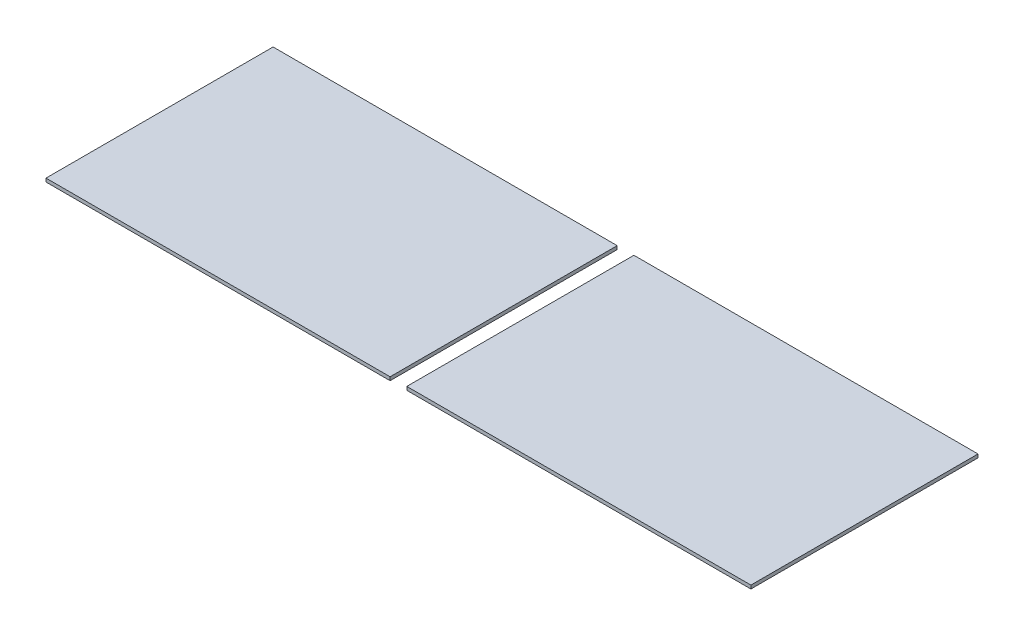
ISO-10303-21;
HEADER;
FILE_DESCRIPTION(('STEP AP214'),'2;1');
FILE_NAME('part.step','',(''),(''),'','','');
FILE_SCHEMA(('AUTOMOTIVE_DESIGN { 1 0 10303 214 1 1 1 1 }'));
ENDSEC;
DATA;
#1=APPLICATION_CONTEXT('core data for automotive mechanical design processes');
#2=APPLICATION_PROTOCOL_DEFINITION('international standard','automotive_design',2000,#1);
#3=PRODUCT_CONTEXT('',#1,'mechanical');
#4=PRODUCT('Part','Part','',(#3));
#5=PRODUCT_RELATED_PRODUCT_CATEGORY('part','',(#4));
#6=PRODUCT_DEFINITION_FORMATION('','',#4);
#7=PRODUCT_DEFINITION_CONTEXT('part definition',#1,'design');
#8=PRODUCT_DEFINITION('design','',#6,#7);
#9=PRODUCT_DEFINITION_SHAPE('','',#8);
#10=(LENGTH_UNIT() NAMED_UNIT(*) SI_UNIT(.MILLI.,.METRE.));
#11=(NAMED_UNIT(*) PLANE_ANGLE_UNIT() SI_UNIT($,.RADIAN.));
#12=(NAMED_UNIT(*) SI_UNIT($,.STERADIAN.) SOLID_ANGLE_UNIT());
#13=UNCERTAINTY_MEASURE_WITH_UNIT(LENGTH_MEASURE(1.E-05),#10,'distance_accuracy_value','');
#14=(GEOMETRIC_REPRESENTATION_CONTEXT(3) GLOBAL_UNCERTAINTY_ASSIGNED_CONTEXT((#13)) GLOBAL_UNIT_ASSIGNED_CONTEXT((#10,
#11,#12)) REPRESENTATION_CONTEXT('',''));
#15=CARTESIAN_POINT('',(0.,0.,0.));
#16=DIRECTION('',(0.,0.,1.));
#17=DIRECTION('',(1.,0.,0.));
#18=AXIS2_PLACEMENT_3D('',#15,#16,#17);
#19=CARTESIAN_POINT('',(-12.1368992991661,5.,-165.));
#20=DIRECTION('',(-1.,0.,0.));
#21=DIRECTION('',(0.,0.,-1.));
#22=AXIS2_PLACEMENT_3D('',#19,#20,#21);
#23=PLANE('',#22);
#24=DIRECTION('',(0.,0.,1.));
#25=VECTOR('',#24,1.);
#26=CARTESIAN_POINT('',(-12.1368992991661,0.,-165.));
#27=LINE('',#26,#25);
#28=CARTESIAN_POINT('',(-12.1368992991661,0.,-165.));
#29=VERTEX_POINT('',#28);
#30=CARTESIAN_POINT('',(-12.1368992991661,0.,165.));
#31=VERTEX_POINT('',#30);
#32=EDGE_CURVE('E106',#29,#31,#27,.T.);
#33=ORIENTED_EDGE('',*,*,#32,.F.);
#34=DIRECTION('',(0.,-1.,0.));
#35=VECTOR('',#34,1.);
#36=CARTESIAN_POINT('',(-12.1368992991661,5.,-165.));
#37=LINE('',#36,#35);
#38=CARTESIAN_POINT('',(-12.1368992991661,5.,-165.));
#39=VERTEX_POINT('',#38);
#40=EDGE_CURVE('E105',#39,#29,#37,.T.);
#41=ORIENTED_EDGE('',*,*,#40,.F.);
#42=DIRECTION('',(0.,0.,1.));
#43=VECTOR('',#42,1.);
#44=CARTESIAN_POINT('',(-12.1368992991661,5.,-165.));
#45=LINE('',#44,#43);
#46=CARTESIAN_POINT('',(-12.1368992991661,5.,165.));
#47=VERTEX_POINT('',#46);
#48=EDGE_CURVE('E100',#39,#47,#45,.T.);
#49=ORIENTED_EDGE('',*,*,#48,.T.);
#50=DIRECTION('',(0.,-1.,0.));
#51=VECTOR('',#50,1.);
#52=CARTESIAN_POINT('',(-12.1368992991661,5.,165.));
#53=LINE('',#52,#51);
#54=EDGE_CURVE('E12',#47,#31,#53,.T.);
#55=ORIENTED_EDGE('',*,*,#54,.T.);
#56=EDGE_LOOP('',(#33,#41,#49,#55));
#57=FACE_BOUND('',#56,.T.);
#58=ADVANCED_FACE('F43',(#57),#23,.F.);
#59=CARTESIAN_POINT('',(-12.1368992991661,5.,165.));
#60=DIRECTION('',(0.,0.,-1.));
#61=DIRECTION('',(1.,0.,0.));
#62=AXIS2_PLACEMENT_3D('',#59,#60,#61);
#63=PLANE('',#62);
#64=DIRECTION('',(-1.,0.,0.));
#65=VECTOR('',#64,1.);
#66=CARTESIAN_POINT('',(-12.1368992991661,0.,165.));
#67=LINE('',#66,#65);
#68=CARTESIAN_POINT('',(-512.136899299166,0.,165.));
#69=VERTEX_POINT('',#68);
#70=EDGE_CURVE('E108',#31,#69,#67,.T.);
#71=ORIENTED_EDGE('',*,*,#70,.F.);
#72=ORIENTED_EDGE('',*,*,#54,.F.);
#73=DIRECTION('',(-1.,0.,0.));
#74=VECTOR('',#73,1.);
#75=CARTESIAN_POINT('',(-12.1368992991661,5.,165.));
#76=LINE('',#75,#74);
#77=CARTESIAN_POINT('',(-512.136899299166,5.,165.));
#78=VERTEX_POINT('',#77);
#79=EDGE_CURVE('E84',#47,#78,#76,.T.);
#80=ORIENTED_EDGE('',*,*,#79,.T.);
#81=DIRECTION('',(0.,-1.,0.));
#82=VECTOR('',#81,1.);
#83=CARTESIAN_POINT('',(-512.136899299166,5.,165.));
#84=LINE('',#83,#82);
#85=EDGE_CURVE('E51',#78,#69,#84,.T.);
#86=ORIENTED_EDGE('',*,*,#85,.T.);
#87=EDGE_LOOP('',(#71,#72,#80,#86));
#88=FACE_BOUND('',#87,.T.);
#89=ADVANCED_FACE('F98',(#88),#63,.F.);
#90=CARTESIAN_POINT('',(-512.136899299166,5.,-165.));
#91=DIRECTION('',(1.,0.,0.));
#92=DIRECTION('',(0.,0.,1.));
#93=AXIS2_PLACEMENT_3D('',#90,#91,#92);
#94=PLANE('',#93);
#95=DIRECTION('',(0.,0.,-1.));
#96=VECTOR('',#95,1.);
#97=CARTESIAN_POINT('',(-512.136899299166,0.,-165.));
#98=LINE('',#97,#96);
#99=CARTESIAN_POINT('',(-512.136899299166,0.,-165.));
#100=VERTEX_POINT('',#99);
#101=EDGE_CURVE('E94',#69,#100,#98,.T.);
#102=ORIENTED_EDGE('',*,*,#101,.F.);
#103=ORIENTED_EDGE('',*,*,#85,.F.);
#104=DIRECTION('',(0.,0.,-1.));
#105=VECTOR('',#104,1.);
#106=CARTESIAN_POINT('',(-512.136899299166,5.,-165.));
#107=LINE('',#106,#105);
#108=CARTESIAN_POINT('',(-512.136899299166,5.,-165.));
#109=VERTEX_POINT('',#108);
#110=EDGE_CURVE('E87',#78,#109,#107,.T.);
#111=ORIENTED_EDGE('',*,*,#110,.T.);
#112=DIRECTION('',(0.,-1.,0.));
#113=VECTOR('',#112,1.);
#114=CARTESIAN_POINT('',(-512.136899299166,5.,-165.));
#115=LINE('',#114,#113);
#116=EDGE_CURVE('E97',#109,#100,#115,.T.);
#117=ORIENTED_EDGE('',*,*,#116,.T.);
#118=EDGE_LOOP('',(#102,#103,#111,#117));
#119=FACE_BOUND('',#118,.T.);
#120=ADVANCED_FACE('F93',(#119),#94,.F.);
#121=CARTESIAN_POINT('',(-12.1368992991661,5.,-165.));
#122=DIRECTION('',(0.,0.,1.));
#123=DIRECTION('',(-1.,0.,0.));
#124=AXIS2_PLACEMENT_3D('',#121,#122,#123);
#125=PLANE('',#124);
#126=DIRECTION('',(1.,0.,0.));
#127=VECTOR('',#126,1.);
#128=CARTESIAN_POINT('',(-12.1368992991661,0.,-165.));
#129=LINE('',#128,#127);
#130=EDGE_CURVE('E73',#100,#29,#129,.T.);
#131=ORIENTED_EDGE('',*,*,#130,.F.);
#132=ORIENTED_EDGE('',*,*,#116,.F.);
#133=DIRECTION('',(1.,0.,0.));
#134=VECTOR('',#133,1.);
#135=CARTESIAN_POINT('',(-12.1368992991661,5.,-165.));
#136=LINE('',#135,#134);
#137=EDGE_CURVE('E59',#109,#39,#136,.T.);
#138=ORIENTED_EDGE('',*,*,#137,.T.);
#139=ORIENTED_EDGE('',*,*,#40,.T.);
#140=EDGE_LOOP('',(#131,#132,#138,#139));
#141=FACE_BOUND('',#140,.T.);
#142=ADVANCED_FACE('F117',(#141),#125,.F.);
#143=CARTESIAN_POINT('',(0.,5.,0.));
#144=DIRECTION('',(0.,1.,0.));
#145=DIRECTION('',(0.,0.,1.));
#146=AXIS2_PLACEMENT_3D('',#143,#144,#145);
#147=PLANE('',#146);
#148=ORIENTED_EDGE('',*,*,#48,.F.);
#149=ORIENTED_EDGE('',*,*,#137,.F.);
#150=ORIENTED_EDGE('',*,*,#110,.F.);
#151=ORIENTED_EDGE('',*,*,#79,.F.);
#152=EDGE_LOOP('',(#148,#149,#150,#151));
#153=FACE_BOUND('',#152,.T.);
#154=ADVANCED_FACE('F89',(#153),#147,.T.);
#155=CARTESIAN_POINT('',(0.,0.,0.));
#156=DIRECTION('',(0.,1.,0.));
#157=DIRECTION('',(0.,0.,1.));
#158=AXIS2_PLACEMENT_3D('',#155,#156,#157);
#159=PLANE('',#158);
#160=ORIENTED_EDGE('',*,*,#32,.T.);
#161=ORIENTED_EDGE('',*,*,#70,.T.);
#162=ORIENTED_EDGE('',*,*,#101,.T.);
#163=ORIENTED_EDGE('',*,*,#130,.T.);
#164=EDGE_LOOP('',(#160,#161,#162,#163));
#165=FACE_BOUND('',#164,.T.);
#166=ADVANCED_FACE('F113',(#165),#159,.F.);
#167=CLOSED_SHELL('',(#58,#89,#120,#142,#154,#166));
#168=MANIFOLD_SOLID_BREP('B2',#167);
#169=CARTESIAN_POINT('',(12.1368992991661,5.,-165.));
#170=DIRECTION('',(1.,0.,0.));
#171=DIRECTION('',(0.,0.,-1.));
#172=AXIS2_PLACEMENT_3D('',#169,#170,#171);
#173=PLANE('',#172);
#174=DIRECTION('',(0.,0.,1.));
#175=VECTOR('',#174,1.);
#176=CARTESIAN_POINT('',(12.1368992991661,0.,-165.));
#177=LINE('',#176,#175);
#178=CARTESIAN_POINT('',(12.1368992991661,0.,-165.));
#179=VERTEX_POINT('',#178);
#180=CARTESIAN_POINT('',(12.1368992991661,0.,165.));
#181=VERTEX_POINT('',#180);
#182=EDGE_CURVE('E230',#179,#181,#177,.T.);
#183=ORIENTED_EDGE('',*,*,#182,.T.);
#184=DIRECTION('',(0.,-1.,0.));
#185=VECTOR('',#184,1.);
#186=CARTESIAN_POINT('',(12.1368992991661,5.,165.));
#187=LINE('',#186,#185);
#188=CARTESIAN_POINT('',(12.1368992991661,5.,165.));
#189=VERTEX_POINT('',#188);
#190=EDGE_CURVE('E41',#189,#181,#187,.T.);
#191=ORIENTED_EDGE('',*,*,#190,.F.);
#192=DIRECTION('',(0.,0.,1.));
#193=VECTOR('',#192,1.);
#194=CARTESIAN_POINT('',(12.1368992991661,5.,-165.));
#195=LINE('',#194,#193);
#196=CARTESIAN_POINT('',(12.1368992991661,5.,-165.));
#197=VERTEX_POINT('',#196);
#198=EDGE_CURVE('E218',#197,#189,#195,.T.);
#199=ORIENTED_EDGE('',*,*,#198,.F.);
#200=DIRECTION('',(0.,-1.,0.));
#201=VECTOR('',#200,1.);
#202=CARTESIAN_POINT('',(12.1368992991661,5.,-165.));
#203=LINE('',#202,#201);
#204=EDGE_CURVE('E226',#197,#179,#203,.T.);
#205=ORIENTED_EDGE('',*,*,#204,.T.);
#206=EDGE_LOOP('',(#183,#191,#199,#205));
#207=FACE_BOUND('',#206,.T.);
#208=ADVANCED_FACE('F167',(#207),#173,.F.);
#209=CARTESIAN_POINT('',(12.1368992991661,5.,165.));
#210=DIRECTION('',(0.,0.,-1.));
#211=DIRECTION('',(-1.,0.,0.));
#212=AXIS2_PLACEMENT_3D('',#209,#210,#211);
#213=PLANE('',#212);
#214=DIRECTION('',(1.,0.,0.));
#215=VECTOR('',#214,1.);
#216=CARTESIAN_POINT('',(12.1368992991661,0.,165.));
#217=LINE('',#216,#215);
#218=CARTESIAN_POINT('',(512.136899299166,0.,165.));
#219=VERTEX_POINT('',#218);
#220=EDGE_CURVE('E222',#181,#219,#217,.T.);
#221=ORIENTED_EDGE('',*,*,#220,.T.);
#222=DIRECTION('',(0.,-1.,0.));
#223=VECTOR('',#222,1.);
#224=CARTESIAN_POINT('',(512.136899299166,5.,165.));
#225=LINE('',#224,#223);
#226=CARTESIAN_POINT('',(512.136899299166,5.,165.));
#227=VERTEX_POINT('',#226);
#228=EDGE_CURVE('E175',#227,#219,#225,.T.);
#229=ORIENTED_EDGE('',*,*,#228,.F.);
#230=DIRECTION('',(1.,0.,0.));
#231=VECTOR('',#230,1.);
#232=CARTESIAN_POINT('',(12.1368992991661,5.,165.));
#233=LINE('',#232,#231);
#234=EDGE_CURVE('E213',#189,#227,#233,.T.);
#235=ORIENTED_EDGE('',*,*,#234,.F.);
#236=ORIENTED_EDGE('',*,*,#190,.T.);
#237=EDGE_LOOP('',(#221,#229,#235,#236));
#238=FACE_BOUND('',#237,.T.);
#239=ADVANCED_FACE('F221',(#238),#213,.F.);
#240=CARTESIAN_POINT('',(512.136899299166,5.,-165.));
#241=DIRECTION('',(-1.,0.,0.));
#242=DIRECTION('',(0.,0.,1.));
#243=AXIS2_PLACEMENT_3D('',#240,#241,#242);
#244=PLANE('',#243);
#245=DIRECTION('',(0.,0.,-1.));
#246=VECTOR('',#245,1.);
#247=CARTESIAN_POINT('',(512.136899299166,0.,-165.));
#248=LINE('',#247,#246);
#249=CARTESIAN_POINT('',(512.136899299166,0.,-165.));
#250=VERTEX_POINT('',#249);
#251=EDGE_CURVE('E200',#219,#250,#248,.T.);
#252=ORIENTED_EDGE('',*,*,#251,.T.);
#253=DIRECTION('',(0.,-1.,0.));
#254=VECTOR('',#253,1.);
#255=CARTESIAN_POINT('',(512.136899299166,5.,-165.));
#256=LINE('',#255,#254);
#257=CARTESIAN_POINT('',(512.136899299166,5.,-165.));
#258=VERTEX_POINT('',#257);
#259=EDGE_CURVE('E223',#258,#250,#256,.T.);
#260=ORIENTED_EDGE('',*,*,#259,.F.);
#261=DIRECTION('',(0.,0.,-1.));
#262=VECTOR('',#261,1.);
#263=CARTESIAN_POINT('',(512.136899299166,5.,-165.));
#264=LINE('',#263,#262);
#265=EDGE_CURVE('E216',#227,#258,#264,.T.);
#266=ORIENTED_EDGE('',*,*,#265,.F.);
#267=ORIENTED_EDGE('',*,*,#228,.T.);
#268=EDGE_LOOP('',(#252,#260,#266,#267));
#269=FACE_BOUND('',#268,.T.);
#270=ADVANCED_FACE('F224',(#269),#244,.F.);
#271=CARTESIAN_POINT('',(12.1368992991661,5.,-165.));
#272=DIRECTION('',(0.,0.,1.));
#273=DIRECTION('',(1.,0.,0.));
#274=AXIS2_PLACEMENT_3D('',#271,#272,#273);
#275=PLANE('',#274);
#276=DIRECTION('',(-1.,0.,0.));
#277=VECTOR('',#276,1.);
#278=CARTESIAN_POINT('',(12.1368992991661,0.,-165.));
#279=LINE('',#278,#277);
#280=EDGE_CURVE('E206',#250,#179,#279,.T.);
#281=ORIENTED_EDGE('',*,*,#280,.T.);
#282=ORIENTED_EDGE('',*,*,#204,.F.);
#283=DIRECTION('',(-1.,0.,0.));
#284=VECTOR('',#283,1.);
#285=CARTESIAN_POINT('',(12.1368992991661,5.,-165.));
#286=LINE('',#285,#284);
#287=EDGE_CURVE('E183',#258,#197,#286,.T.);
#288=ORIENTED_EDGE('',*,*,#287,.F.);
#289=ORIENTED_EDGE('',*,*,#259,.T.);
#290=EDGE_LOOP('',(#281,#282,#288,#289));
#291=FACE_BOUND('',#290,.T.);
#292=ADVANCED_FACE('F237',(#291),#275,.F.);
#293=CARTESIAN_POINT('',(0.,5.,0.));
#294=DIRECTION('',(0.,1.,0.));
#295=DIRECTION('',(0.,0.,1.));
#296=AXIS2_PLACEMENT_3D('',#293,#294,#295);
#297=PLANE('',#296);
#298=ORIENTED_EDGE('',*,*,#198,.T.);
#299=ORIENTED_EDGE('',*,*,#234,.T.);
#300=ORIENTED_EDGE('',*,*,#265,.T.);
#301=ORIENTED_EDGE('',*,*,#287,.T.);
#302=EDGE_LOOP('',(#298,#299,#300,#301));
#303=FACE_BOUND('',#302,.T.);
#304=ADVANCED_FACE('F214',(#303),#297,.T.);
#305=CARTESIAN_POINT('',(0.,0.,0.));
#306=DIRECTION('',(0.,1.,0.));
#307=DIRECTION('',(0.,0.,1.));
#308=AXIS2_PLACEMENT_3D('',#305,#306,#307);
#309=PLANE('',#308);
#310=ORIENTED_EDGE('',*,*,#182,.F.);
#311=ORIENTED_EDGE('',*,*,#280,.F.);
#312=ORIENTED_EDGE('',*,*,#251,.F.);
#313=ORIENTED_EDGE('',*,*,#220,.F.);
#314=EDGE_LOOP('',(#310,#311,#312,#313));
#315=FACE_BOUND('',#314,.T.);
#316=ADVANCED_FACE('F240',(#315),#309,.F.);
#317=CLOSED_SHELL('',(#208,#239,#270,#292,#304,#316));
#318=MANIFOLD_SOLID_BREP('B6',#317);
#319=ADVANCED_BREP_SHAPE_REPRESENTATION('',(#18,#168,#318),#14);
#320=SHAPE_DEFINITION_REPRESENTATION(#9,#319);
ENDSEC;
END-ISO-10303-21;
